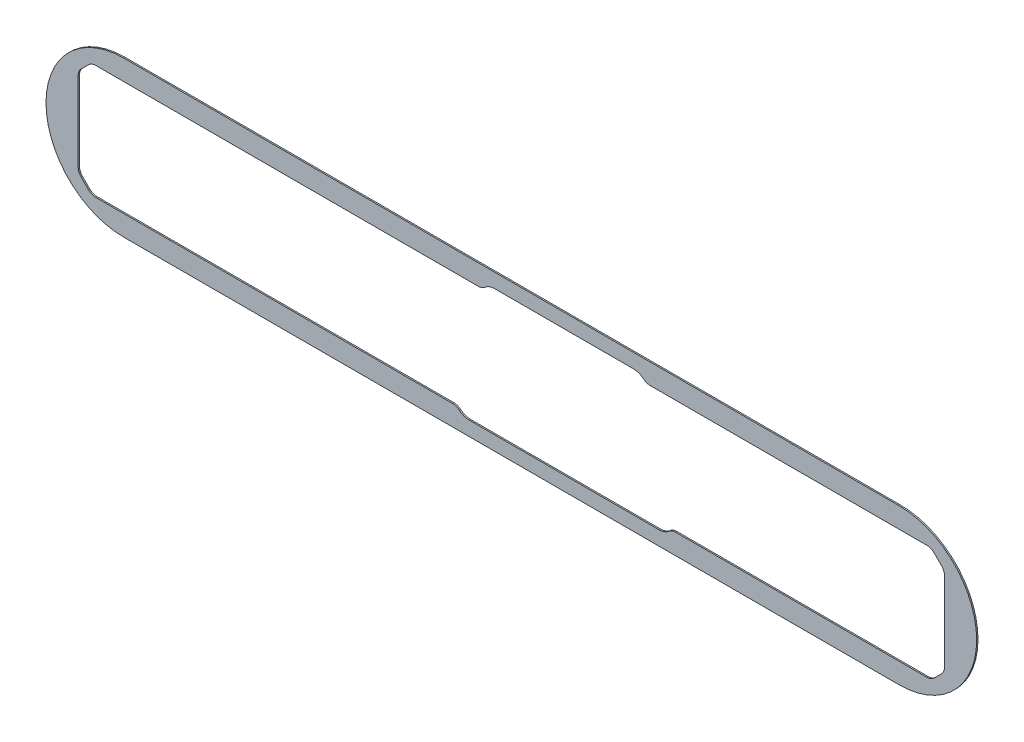
ISO-10303-21;
HEADER;
FILE_DESCRIPTION(('STEP AP214'),'2;1');
FILE_NAME('part.step','',(''),(''),'','','');
FILE_SCHEMA(('AUTOMOTIVE_DESIGN { 1 0 10303 214 1 1 1 1 }'));
ENDSEC;
DATA;
#1=APPLICATION_CONTEXT('core data for automotive mechanical design processes');
#2=APPLICATION_PROTOCOL_DEFINITION('international standard','automotive_design',2000,#1);
#3=PRODUCT_CONTEXT('',#1,'mechanical');
#4=PRODUCT('Part','Part','',(#3));
#5=PRODUCT_RELATED_PRODUCT_CATEGORY('part','',(#4));
#6=PRODUCT_DEFINITION_FORMATION('','',#4);
#7=PRODUCT_DEFINITION_CONTEXT('part definition',#1,'design');
#8=PRODUCT_DEFINITION('design','',#6,#7);
#9=PRODUCT_DEFINITION_SHAPE('','',#8);
#10=(LENGTH_UNIT() NAMED_UNIT(*) SI_UNIT(.MILLI.,.METRE.));
#11=(NAMED_UNIT(*) PLANE_ANGLE_UNIT() SI_UNIT($,.RADIAN.));
#12=(NAMED_UNIT(*) SI_UNIT($,.STERADIAN.) SOLID_ANGLE_UNIT());
#13=UNCERTAINTY_MEASURE_WITH_UNIT(LENGTH_MEASURE(1.E-05),#10,'distance_accuracy_value','');
#14=(GEOMETRIC_REPRESENTATION_CONTEXT(3) GLOBAL_UNCERTAINTY_ASSIGNED_CONTEXT((#13)) GLOBAL_UNIT_ASSIGNED_CONTEXT((#10,
#11,#12)) REPRESENTATION_CONTEXT('',''));
#15=CARTESIAN_POINT('',(0.,0.,0.));
#16=DIRECTION('',(0.,0.,1.));
#17=DIRECTION('',(1.,0.,0.));
#18=AXIS2_PLACEMENT_3D('',#15,#16,#17);
#19=CARTESIAN_POINT('',(16.09980768536,-6.6,-50.771344));
#20=DIRECTION('',(-5.226938539498E-11,0.,1.));
#21=DIRECTION('',(0.,1.,0.));
#22=AXIS2_PLACEMENT_3D('',#19,#20,#21);
#23=CYLINDRICAL_SURFACE('',#22,1.);
#24=DIRECTION('',(-5.233420534541E-11,0.,1.));
#25=VECTOR('',#24,1.);
#26=CARTESIAN_POINT('',(16.09980768275,-5.6,-0.805));
#27=LINE('',#26,#25);
#28=CARTESIAN_POINT('',(16.09980768275,-5.6,-0.805));
#29=VERTEX_POINT('',#28);
#30=CARTESIAN_POINT('',(16.09980768274,-5.6,-0.675));
#31=VERTEX_POINT('',#30);
#32=EDGE_CURVE('E600',#29,#31,#27,.T.);
#33=ORIENTED_EDGE('',*,*,#32,.F.);
#34=CARTESIAN_POINT('',(16.09980768275,-6.6,-0.8049999999822));
#35=DIRECTION('',(5.22693650197882E-11,0.,-1.));
#36=DIRECTION('',(-0.649923072370997,0.759999999999897,-3.39710481966899E-11));
#37=AXIS2_PLACEMENT_3D('',#34,#35,#36);
#38=CIRCLE('',#37,1.);
#39=CARTESIAN_POINT('',(15.44988461038,-5.84,-0.805));
#40=VERTEX_POINT('',#39);
#41=EDGE_CURVE('E353',#40,#29,#38,.T.);
#42=ORIENTED_EDGE('',*,*,#41,.F.);
#43=DIRECTION('',(-5.226588392851E-11,0.,1.));
#44=VECTOR('',#43,1.);
#45=CARTESIAN_POINT('',(15.44988461038,-5.84,-0.805));
#46=LINE('',#45,#44);
#47=CARTESIAN_POINT('',(15.44988461037,-5.84,-0.6750000000161));
#48=VERTEX_POINT('',#47);
#49=EDGE_CURVE('E11',#40,#48,#46,.T.);
#50=ORIENTED_EDGE('',*,*,#49,.T.);
#51=CARTESIAN_POINT('',(16.09980768274,-6.6,-0.6749999999822));
#52=DIRECTION('',(-5.226938539498E-11,0.,1.));
#53=DIRECTION('',(0.,1.,0.));
#54=AXIS2_PLACEMENT_3D('',#51,#52,#53);
#55=CIRCLE('',#54,1.);
#56=EDGE_CURVE('E484',#31,#48,#55,.T.);
#57=ORIENTED_EDGE('',*,*,#56,.F.);
#58=EDGE_LOOP('',(#33,#42,#50,#57));
#59=FACE_BOUND('',#58,.T.);
#60=ADVANCED_FACE('F16',(#59),#23,.T.);
#61=CARTESIAN_POINT('',(14.47500000028,-4.7,28.731344));
#62=DIRECTION('',(5.2269385394983E-11,0.,-1.));
#63=DIRECTION('',(0.7999999998137,-0.6000000002484,4.181550830625E-11));
#64=AXIS2_PLACEMENT_3D('',#61,#62,#63);
#65=CYLINDRICAL_SURFACE('',#64,1.5);
#66=CARTESIAN_POINT('',(14.47500000182,-4.7,-0.8050000000267));
#67=DIRECTION('',(-5.226938539498E-11,0.,1.));
#68=DIRECTION('',(-1.21549466788E-09,-1.,0.));
#69=AXIS2_PLACEMENT_3D('',#66,#67,#68);
#70=CIRCLE('',#69,1.5);
#71=CARTESIAN_POINT('',(14.475,-6.2,-0.805));
#72=VERTEX_POINT('',#71);
#73=EDGE_CURVE('E358',#72,#40,#70,.T.);
#74=ORIENTED_EDGE('',*,*,#73,.F.);
#75=DIRECTION('',(0.,0.,-1.));
#76=VECTOR('',#75,1.);
#77=CARTESIAN_POINT('',(14.475,-6.2,-0.675));
#78=LINE('',#77,#76);
#79=CARTESIAN_POINT('',(14.475,-6.2,-0.675));
#80=VERTEX_POINT('',#79);
#81=EDGE_CURVE('E27',#80,#72,#78,.T.);
#82=ORIENTED_EDGE('',*,*,#81,.F.);
#83=CARTESIAN_POINT('',(14.47500000182,-4.7,-0.6750000000267));
#84=DIRECTION('',(5.2269365019795E-11,0.,-1.));
#85=DIRECTION('',(0.649923072370783,-0.76000000000008,3.39710481966891E-11));
#86=AXIS2_PLACEMENT_3D('',#83,#84,#85);
#87=CIRCLE('',#86,1.5);
#88=EDGE_CURVE('E386',#48,#80,#87,.T.);
#89=ORIENTED_EDGE('',*,*,#88,.F.);
#90=ORIENTED_EDGE('',*,*,#49,.F.);
#91=EDGE_LOOP('',(#74,#82,#89,#90));
#92=FACE_BOUND('',#91,.T.);
#93=ADVANCED_FACE('F577',(#92),#65,.F.);
#94=CARTESIAN_POINT('',(-5.325,-6.2,0.));
#95=DIRECTION('',(0.,-1.,0.));
#96=DIRECTION('',(0.,0.,-1.));
#97=AXIS2_PLACEMENT_3D('',#94,#95,#96);
#98=PLANE('',#97);
#99=ORIENTED_EDGE('',*,*,#81,.T.);
#100=DIRECTION('',(1.,0.,0.));
#101=VECTOR('',#100,1.);
#102=CARTESIAN_POINT('',(-4.125,-6.2,-0.805));
#103=LINE('',#102,#101);
#104=CARTESIAN_POINT('',(-4.125,-6.2,-0.805));
#105=VERTEX_POINT('',#104);
#106=EDGE_CURVE('E595',#105,#72,#103,.T.);
#107=ORIENTED_EDGE('',*,*,#106,.F.);
#108=DIRECTION('',(0.,0.,-1.));
#109=VECTOR('',#108,1.);
#110=CARTESIAN_POINT('',(-4.125,-6.2,-0.675));
#111=LINE('',#110,#109);
#112=CARTESIAN_POINT('',(-4.125,-6.2,-0.675));
#113=VERTEX_POINT('',#112);
#114=EDGE_CURVE('E348',#113,#105,#111,.T.);
#115=ORIENTED_EDGE('',*,*,#114,.F.);
#116=DIRECTION('',(1.,0.,0.));
#117=VECTOR('',#116,1.);
#118=CARTESIAN_POINT('',(-4.125,-6.2,-0.675));
#119=LINE('',#118,#117);
#120=EDGE_CURVE('E381',#113,#80,#119,.T.);
#121=ORIENTED_EDGE('',*,*,#120,.T.);
#122=EDGE_LOOP('',(#99,#107,#115,#121));
#123=FACE_BOUND('',#122,.T.);
#124=ADVANCED_FACE('F745',(#123),#98,.F.);
#125=CARTESIAN_POINT('',(-4.12499999553,-4.7,28.731344));
#126=DIRECTION('',(0.,0.,-1.));
#127=DIRECTION('',(-0.8000000029802,-0.5999999960264,0.));
#128=AXIS2_PLACEMENT_3D('',#125,#126,#127);
#129=CYLINDRICAL_SURFACE('',#128,1.5);
#130=CARTESIAN_POINT('',(-4.12499999553,-4.7,-0.675));
#131=DIRECTION('',(0.,0.,-1.));
#132=DIRECTION('',(-2.980231765074E-09,-1.,0.));
#133=AXIS2_PLACEMENT_3D('',#130,#131,#132);
#134=CIRCLE('',#133,1.5);
#135=CARTESIAN_POINT('',(-5.099884604086,-5.84,-0.675));
#136=VERTEX_POINT('',#135);
#137=EDGE_CURVE('E385',#113,#136,#134,.T.);
#138=ORIENTED_EDGE('',*,*,#137,.F.);
#139=ORIENTED_EDGE('',*,*,#114,.T.);
#140=CARTESIAN_POINT('',(-4.12499999553,-4.7,-0.805));
#141=DIRECTION('',(0.,0.,1.));
#142=DIRECTION('',(-0.64992307237094,-0.759999999999946,0.));
#143=AXIS2_PLACEMENT_3D('',#140,#141,#142);
#144=CIRCLE('',#143,1.5);
#145=CARTESIAN_POINT('',(-5.099884604086,-5.84,-0.805));
#146=VERTEX_POINT('',#145);
#147=EDGE_CURVE('E454',#146,#105,#144,.T.);
#148=ORIENTED_EDGE('',*,*,#147,.F.);
#149=DIRECTION('',(0.,0.,-1.));
#150=VECTOR('',#149,1.);
#151=CARTESIAN_POINT('',(-5.099884604086,-5.84,-0.675));
#152=LINE('',#151,#150);
#153=EDGE_CURVE('E352',#136,#146,#152,.T.);
#154=ORIENTED_EDGE('',*,*,#153,.F.);
#155=EDGE_LOOP('',(#138,#139,#148,#154));
#156=FACE_BOUND('',#155,.T.);
#157=ADVANCED_FACE('F775',(#156),#129,.F.);
#158=CARTESIAN_POINT('',(-5.749807676457,-6.6,28.731344));
#159=DIRECTION('',(0.,0.,-1.));
#160=DIRECTION('',(0.,1.,0.));
#161=AXIS2_PLACEMENT_3D('',#158,#159,#160);
#162=CYLINDRICAL_SURFACE('',#161,1.);
#163=DIRECTION('',(0.,0.,-1.));
#164=VECTOR('',#163,1.);
#165=CARTESIAN_POINT('',(-5.749807676457,-5.6,-0.675));
#166=LINE('',#165,#164);
#167=CARTESIAN_POINT('',(-5.749807676457,-5.6,-0.675));
#168=VERTEX_POINT('',#167);
#169=CARTESIAN_POINT('',(-5.749807676457,-5.6,-0.805));
#170=VERTEX_POINT('',#169);
#171=EDGE_CURVE('E509',#168,#170,#166,.T.);
#172=ORIENTED_EDGE('',*,*,#171,.F.);
#173=CARTESIAN_POINT('',(-5.749807676457,-6.6,-0.675));
#174=DIRECTION('',(0.,0.,1.));
#175=DIRECTION('',(0.649923072370783,0.76000000000008,0.));
#176=AXIS2_PLACEMENT_3D('',#173,#174,#175);
#177=CIRCLE('',#176,1.);
#178=EDGE_CURVE('E446',#136,#168,#177,.T.);
#179=ORIENTED_EDGE('',*,*,#178,.F.);
#180=ORIENTED_EDGE('',*,*,#153,.T.);
#181=CARTESIAN_POINT('',(-5.749807676457,-6.6,-0.805));
#182=DIRECTION('',(0.,0.,-1.));
#183=DIRECTION('',(0.,1.,0.));
#184=AXIS2_PLACEMENT_3D('',#181,#182,#183);
#185=CIRCLE('',#184,1.);
#186=EDGE_CURVE('E373',#170,#146,#185,.T.);
#187=ORIENTED_EDGE('',*,*,#186,.F.);
#188=EDGE_LOOP('',(#172,#179,#180,#187));
#189=FACE_BOUND('',#188,.T.);
#190=ADVANCED_FACE('F724',(#189),#162,.T.);
#191=CARTESIAN_POINT('',(-40.72431457505,4.6,28.731344));
#192=DIRECTION('',(0.,0.,-1.));
#193=DIRECTION('',(-0.707106781186548,0.707106781186548,0.));
#194=AXIS2_PLACEMENT_3D('',#191,#192,#193);
#195=CYLINDRICAL_SURFACE('',#194,1.);
#196=CARTESIAN_POINT('',(-40.72431457505,4.6,-0.805));
#197=DIRECTION('',(0.,0.,1.));
#198=DIRECTION('',(0.,1.,0.));
#199=AXIS2_PLACEMENT_3D('',#196,#197,#198);
#200=CIRCLE('',#199,1.);
#201=CARTESIAN_POINT('',(-40.72431457505,5.6,-0.805));
#202=VERTEX_POINT('',#201);
#203=CARTESIAN_POINT('',(-41.43142135624,5.307106781187,-0.805));
#204=VERTEX_POINT('',#203);
#205=EDGE_CURVE('E347',#202,#204,#200,.T.);
#206=ORIENTED_EDGE('',*,*,#205,.F.);
#207=DIRECTION('',(0.,0.,-1.));
#208=VECTOR('',#207,1.);
#209=CARTESIAN_POINT('',(-40.72431457505,5.6,-0.675));
#210=LINE('',#209,#208);
#211=CARTESIAN_POINT('',(-40.72431457505,5.6,-0.675));
#212=VERTEX_POINT('',#211);
#213=EDGE_CURVE('E423',#212,#202,#210,.T.);
#214=ORIENTED_EDGE('',*,*,#213,.F.);
#215=CARTESIAN_POINT('',(-40.72431457505,4.6,-0.675));
#216=DIRECTION('',(0.,0.,-1.));
#217=DIRECTION('',(-0.707106781186548,0.707106781186548,0.));
#218=AXIS2_PLACEMENT_3D('',#215,#216,#217);
#219=CIRCLE('',#218,1.);
#220=CARTESIAN_POINT('',(-41.43142135624,5.307106781187,-0.675));
#221=VERTEX_POINT('',#220);
#222=EDGE_CURVE('E363',#221,#212,#219,.T.);
#223=ORIENTED_EDGE('',*,*,#222,.F.);
#224=DIRECTION('',(0.,0.,-1.));
#225=VECTOR('',#224,1.);
#226=CARTESIAN_POINT('',(-41.43142135624,5.307106781187,-0.675));
#227=LINE('',#226,#225);
#228=EDGE_CURVE('E480',#221,#204,#227,.T.);
#229=ORIENTED_EDGE('',*,*,#228,.T.);
#230=EDGE_LOOP('',(#206,#214,#223,#229));
#231=FACE_BOUND('',#230,.T.);
#232=ADVANCED_FACE('F669',(#231),#195,.F.);
#233=CARTESIAN_POINT('',(-41.13852813742,5.6,0.));
#234=DIRECTION('',(-0.707106781186548,0.707106781186548,0.));
#235=DIRECTION('',(0.,0.,1.));
#236=AXIS2_PLACEMENT_3D('',#233,#234,#235);
#237=PLANE('',#236);
#238=DIRECTION('',(-0.707106781186498,-0.707106781186598,0.));
#239=VECTOR('',#238,1.);
#240=CARTESIAN_POINT('',(-41.43142135624,5.307106781187,-0.675));
#241=LINE('',#240,#239);
#242=CARTESIAN_POINT('',(-42.15710678119,4.581421356237,-0.675));
#243=VERTEX_POINT('',#242);
#244=EDGE_CURVE('E359',#221,#243,#241,.T.);
#245=ORIENTED_EDGE('',*,*,#244,.T.);
#246=DIRECTION('',(0.,0.,-1.));
#247=VECTOR('',#246,1.);
#248=CARTESIAN_POINT('',(-42.15710678119,4.581421356237,-0.675));
#249=LINE('',#248,#247);
#250=CARTESIAN_POINT('',(-42.15710678119,4.581421356237,-0.805));
#251=VERTEX_POINT('',#250);
#252=EDGE_CURVE('E486',#243,#251,#249,.T.);
#253=ORIENTED_EDGE('',*,*,#252,.T.);
#254=DIRECTION('',(-0.707106781186498,-0.707106781186598,0.));
#255=VECTOR('',#254,1.);
#256=CARTESIAN_POINT('',(-41.43142135624,5.307106781187,-0.805));
#257=LINE('',#256,#255);
#258=EDGE_CURVE('E342',#204,#251,#257,.T.);
#259=ORIENTED_EDGE('',*,*,#258,.F.);
#260=ORIENTED_EDGE('',*,*,#228,.F.);
#261=EDGE_LOOP('',(#245,#253,#259,#260));
#262=FACE_BOUND('',#261,.T.);
#263=ADVANCED_FACE('F666',(#262),#237,.F.);
#264=CARTESIAN_POINT('',(-41.45,3.874314575051,28.731344));
#265=DIRECTION('',(0.,0.,-1.));
#266=DIRECTION('',(-1.,0.,0.));
#267=AXIS2_PLACEMENT_3D('',#264,#265,#266);
#268=CYLINDRICAL_SURFACE('',#267,1.);
#269=CARTESIAN_POINT('',(-41.45,3.874314575051,-0.805));
#270=DIRECTION('',(0.,0.,1.));
#271=DIRECTION('',(-0.707106781186548,0.707106781186548,0.));
#272=AXIS2_PLACEMENT_3D('',#269,#270,#271);
#273=CIRCLE('',#272,1.);
#274=CARTESIAN_POINT('',(-42.45,3.874314575051,-0.805));
#275=VERTEX_POINT('',#274);
#276=EDGE_CURVE('E346',#251,#275,#273,.T.);
#277=ORIENTED_EDGE('',*,*,#276,.F.);
#278=ORIENTED_EDGE('',*,*,#252,.F.);
#279=CARTESIAN_POINT('',(-41.45,3.874314575051,-0.675));
#280=DIRECTION('',(0.,0.,-1.));
#281=DIRECTION('',(-1.,0.,0.));
#282=AXIS2_PLACEMENT_3D('',#279,#280,#281);
#283=CIRCLE('',#282,1.);
#284=CARTESIAN_POINT('',(-42.45,3.874314575051,-0.675));
#285=VERTEX_POINT('',#284);
#286=EDGE_CURVE('E364',#285,#243,#283,.T.);
#287=ORIENTED_EDGE('',*,*,#286,.F.);
#288=DIRECTION('',(0.,0.,-1.));
#289=VECTOR('',#288,1.);
#290=CARTESIAN_POINT('',(-42.45,3.874314575051,-0.675));
#291=LINE('',#290,#289);
#292=EDGE_CURVE('E335',#285,#275,#291,.T.);
#293=ORIENTED_EDGE('',*,*,#292,.T.);
#294=EDGE_LOOP('',(#277,#278,#287,#293));
#295=FACE_BOUND('',#294,.T.);
#296=ADVANCED_FACE('F661',(#295),#268,.F.);
#297=CARTESIAN_POINT('',(-42.45,4.288528137424,0.));
#298=DIRECTION('',(-1.,0.,0.));
#299=DIRECTION('',(0.,0.,1.));
#300=AXIS2_PLACEMENT_3D('',#297,#298,#299);
#301=PLANE('',#300);
#302=DIRECTION('',(0.,-1.,0.));
#303=VECTOR('',#302,1.);
#304=CARTESIAN_POINT('',(-42.45,3.874314575051,-0.675));
#305=LINE('',#304,#303);
#306=CARTESIAN_POINT('',(-42.45,-3.874314575051,-0.675));
#307=VERTEX_POINT('',#306);
#308=EDGE_CURVE('E450',#285,#307,#305,.T.);
#309=ORIENTED_EDGE('',*,*,#308,.T.);
#310=DIRECTION('',(0.,0.,-1.));
#311=VECTOR('',#310,1.);
#312=CARTESIAN_POINT('',(-42.45,-3.874314575051,-0.675));
#313=LINE('',#312,#311);
#314=CARTESIAN_POINT('',(-42.45,-3.874314575051,-0.805));
#315=VERTEX_POINT('',#314);
#316=EDGE_CURVE('E332',#307,#315,#313,.T.);
#317=ORIENTED_EDGE('',*,*,#316,.T.);
#318=DIRECTION('',(0.,-1.,0.));
#319=VECTOR('',#318,1.);
#320=CARTESIAN_POINT('',(-42.45,3.874314575051,-0.805));
#321=LINE('',#320,#319);
#322=EDGE_CURVE('E368',#275,#315,#321,.T.);
#323=ORIENTED_EDGE('',*,*,#322,.F.);
#324=ORIENTED_EDGE('',*,*,#292,.F.);
#325=EDGE_LOOP('',(#309,#317,#323,#324));
#326=FACE_BOUND('',#325,.T.);
#327=ADVANCED_FACE('F648',(#326),#301,.F.);
#328=CARTESIAN_POINT('',(-41.45,-3.874314575051,28.731344));
#329=DIRECTION('',(0.,0.,-1.));
#330=DIRECTION('',(-0.707106781186548,-0.707106781186548,0.));
#331=AXIS2_PLACEMENT_3D('',#328,#329,#330);
#332=CYLINDRICAL_SURFACE('',#331,1.);
#333=CARTESIAN_POINT('',(-41.45,-3.874314575051,-0.805));
#334=DIRECTION('',(0.,0.,1.));
#335=DIRECTION('',(-1.,0.,0.));
#336=AXIS2_PLACEMENT_3D('',#333,#334,#335);
#337=CIRCLE('',#336,1.);
#338=CARTESIAN_POINT('',(-42.15710678119,-4.581421356237,-0.805));
#339=VERTEX_POINT('',#338);
#340=EDGE_CURVE('E419',#315,#339,#337,.T.);
#341=ORIENTED_EDGE('',*,*,#340,.F.);
#342=ORIENTED_EDGE('',*,*,#316,.F.);
#343=CARTESIAN_POINT('',(-41.45,-3.874314575051,-0.675));
#344=DIRECTION('',(0.,0.,-1.));
#345=DIRECTION('',(-0.707106781186548,-0.707106781186548,0.));
#346=AXIS2_PLACEMENT_3D('',#343,#344,#345);
#347=CIRCLE('',#346,1.);
#348=CARTESIAN_POINT('',(-42.15710678119,-4.581421356237,-0.675));
#349=VERTEX_POINT('',#348);
#350=EDGE_CURVE('E327',#349,#307,#347,.T.);
#351=ORIENTED_EDGE('',*,*,#350,.F.);
#352=DIRECTION('',(0.,0.,-1.));
#353=VECTOR('',#352,1.);
#354=CARTESIAN_POINT('',(-42.15710678119,-4.581421356237,-0.675));
#355=LINE('',#354,#353);
#356=EDGE_CURVE('E336',#349,#339,#355,.T.);
#357=ORIENTED_EDGE('',*,*,#356,.T.);
#358=EDGE_LOOP('',(#341,#342,#351,#357));
#359=FACE_BOUND('',#358,.T.);
#360=ADVANCED_FACE('F656',(#359),#332,.F.);
#361=CARTESIAN_POINT('',(-42.45,-4.288528137424,0.));
#362=DIRECTION('',(-0.707106781186548,-0.707106781186548,0.));
#363=DIRECTION('',(-0.707106781186548,0.707106781186548,0.));
#364=AXIS2_PLACEMENT_3D('',#361,#362,#363);
#365=PLANE('',#364);
#366=DIRECTION('',(0.707106781186498,-0.707106781186598,0.));
#367=VECTOR('',#366,1.);
#368=CARTESIAN_POINT('',(-42.15710678119,-4.581421356237,-0.675));
#369=LINE('',#368,#367);
#370=CARTESIAN_POINT('',(-41.43142135624,-5.307106781187,-0.675));
#371=VERTEX_POINT('',#370);
#372=EDGE_CURVE('E323',#349,#371,#369,.T.);
#373=ORIENTED_EDGE('',*,*,#372,.T.);
#374=DIRECTION('',(0.,0.,-1.));
#375=VECTOR('',#374,1.);
#376=CARTESIAN_POINT('',(-41.43142135624,-5.307106781187,-0.675));
#377=LINE('',#376,#375);
#378=CARTESIAN_POINT('',(-41.43142135624,-5.307106781187,-0.805));
#379=VERTEX_POINT('',#378);
#380=EDGE_CURVE('E617',#371,#379,#377,.T.);
#381=ORIENTED_EDGE('',*,*,#380,.T.);
#382=DIRECTION('',(0.707106781186498,-0.707106781186598,0.));
#383=VECTOR('',#382,1.);
#384=CARTESIAN_POINT('',(-42.15710678119,-4.581421356237,-0.805));
#385=LINE('',#384,#383);
#386=EDGE_CURVE('E397',#339,#379,#385,.T.);
#387=ORIENTED_EDGE('',*,*,#386,.F.);
#388=ORIENTED_EDGE('',*,*,#356,.F.);
#389=EDGE_LOOP('',(#373,#381,#387,#388));
#390=FACE_BOUND('',#389,.T.);
#391=ADVANCED_FACE('F727',(#390),#365,.F.);
#392=CARTESIAN_POINT('',(-40.72431457505,-4.6,28.731344));
#393=DIRECTION('',(0.,0.,-1.));
#394=DIRECTION('',(0.,-1.,0.));
#395=AXIS2_PLACEMENT_3D('',#392,#393,#394);
#396=CYLINDRICAL_SURFACE('',#395,1.);
#397=CARTESIAN_POINT('',(-40.72431457505,-4.6,-0.805));
#398=DIRECTION('',(0.,0.,1.));
#399=DIRECTION('',(-0.707106781186548,-0.707106781186548,0.));
#400=AXIS2_PLACEMENT_3D('',#397,#398,#399);
#401=CIRCLE('',#400,1.);
#402=CARTESIAN_POINT('',(-40.72431457505,-5.6,-0.805));
#403=VERTEX_POINT('',#402);
#404=EDGE_CURVE('E374',#379,#403,#401,.T.);
#405=ORIENTED_EDGE('',*,*,#404,.F.);
#406=ORIENTED_EDGE('',*,*,#380,.F.);
#407=CARTESIAN_POINT('',(-40.72431457505,-4.6,-0.675));
#408=DIRECTION('',(0.,0.,-1.));
#409=DIRECTION('',(0.,-1.,0.));
#410=AXIS2_PLACEMENT_3D('',#407,#408,#409);
#411=CIRCLE('',#410,1.);
#412=CARTESIAN_POINT('',(-40.72431457505,-5.6,-0.675));
#413=VERTEX_POINT('',#412);
#414=EDGE_CURVE('E328',#413,#371,#411,.T.);
#415=ORIENTED_EDGE('',*,*,#414,.F.);
#416=DIRECTION('',(0.,0.,-1.));
#417=VECTOR('',#416,1.);
#418=CARTESIAN_POINT('',(-40.72431457505,-5.6,-0.675));
#419=LINE('',#418,#417);
#420=EDGE_CURVE('E511',#413,#403,#419,.T.);
#421=ORIENTED_EDGE('',*,*,#420,.T.);
#422=EDGE_LOOP('',(#405,#406,#415,#421));
#423=FACE_BOUND('',#422,.T.);
#424=ADVANCED_FACE('F720',(#423),#396,.F.);
#425=CARTESIAN_POINT('',(-41.13852813742,-5.6,0.));
#426=DIRECTION('',(0.,-1.,0.));
#427=DIRECTION('',(0.,0.,-1.));
#428=AXIS2_PLACEMENT_3D('',#425,#426,#427);
#429=PLANE('',#428);
#430=DIRECTION('',(0.,0.,-1.));
#431=VECTOR('',#430,1.);
#432=CARTESIAN_POINT('',(40.72431457505,-5.6,-0.675));
#433=LINE('',#432,#431);
#434=CARTESIAN_POINT('',(40.72431457505,-5.6,-0.675));
#435=VERTEX_POINT('',#434);
#436=CARTESIAN_POINT('',(40.72431457505,-5.6,-0.805));
#437=VERTEX_POINT('',#436);
#438=EDGE_CURVE('E437',#435,#437,#433,.T.);
#439=ORIENTED_EDGE('',*,*,#438,.T.);
#440=DIRECTION('',(1.,0.,0.));
#441=VECTOR('',#440,1.);
#442=CARTESIAN_POINT('',(16.09980768275,-5.6,-0.805));
#443=LINE('',#442,#441);
#444=EDGE_CURVE('E357',#29,#437,#443,.T.);
#445=ORIENTED_EDGE('',*,*,#444,.F.);
#446=ORIENTED_EDGE('',*,*,#32,.T.);
#447=DIRECTION('',(1.,0.,0.));
#448=VECTOR('',#447,1.);
#449=CARTESIAN_POINT('',(16.09980768274,-5.6,-0.675));
#450=LINE('',#449,#448);
#451=EDGE_CURVE('E459',#31,#435,#450,.T.);
#452=ORIENTED_EDGE('',*,*,#451,.T.);
#453=EDGE_LOOP('',(#439,#445,#446,#452));
#454=FACE_BOUND('',#453,.T.);
#455=ADVANCED_FACE('F735',(#454),#429,.F.);
#456=CARTESIAN_POINT('',(-41.13852813742,-5.6,0.));
#457=DIRECTION('',(0.,-1.,0.));
#458=DIRECTION('',(0.,0.,-1.));
#459=AXIS2_PLACEMENT_3D('',#456,#457,#458);
#460=PLANE('',#459);
#461=ORIENTED_EDGE('',*,*,#171,.T.);
#462=DIRECTION('',(1.,0.,0.));
#463=VECTOR('',#462,1.);
#464=CARTESIAN_POINT('',(-40.72431457505,-5.6,-0.805));
#465=LINE('',#464,#463);
#466=EDGE_CURVE('E369',#403,#170,#465,.T.);
#467=ORIENTED_EDGE('',*,*,#466,.F.);
#468=ORIENTED_EDGE('',*,*,#420,.F.);
#469=DIRECTION('',(1.,0.,0.));
#470=VECTOR('',#469,1.);
#471=CARTESIAN_POINT('',(-40.72431457505,-5.6,-0.675));
#472=LINE('',#471,#470);
#473=EDGE_CURVE('E442',#413,#168,#472,.T.);
#474=ORIENTED_EDGE('',*,*,#473,.T.);
#475=EDGE_LOOP('',(#461,#467,#468,#474));
#476=FACE_BOUND('',#475,.T.);
#477=ADVANCED_FACE('F716',(#476),#460,.F.);
#478=CARTESIAN_POINT('',(40.72431457505,-4.6,28.731344));
#479=DIRECTION('',(0.,0.,-1.));
#480=DIRECTION('',(0.707106781186548,-0.707106781186548,0.));
#481=AXIS2_PLACEMENT_3D('',#478,#479,#480);
#482=CYLINDRICAL_SURFACE('',#481,1.);
#483=CARTESIAN_POINT('',(40.72431457505,-4.6,-0.805));
#484=DIRECTION('',(0.,0.,1.));
#485=DIRECTION('',(0.,-1.,0.));
#486=AXIS2_PLACEMENT_3D('',#483,#484,#485);
#487=CIRCLE('',#486,1.);
#488=CARTESIAN_POINT('',(41.43142135624,-5.307106781187,-0.805));
#489=VERTEX_POINT('',#488);
#490=EDGE_CURVE('E522',#437,#489,#487,.T.);
#491=ORIENTED_EDGE('',*,*,#490,.F.);
#492=ORIENTED_EDGE('',*,*,#438,.F.);
#493=CARTESIAN_POINT('',(40.72431457505,-4.6,-0.675));
#494=DIRECTION('',(0.,0.,-1.));
#495=DIRECTION('',(0.707106781186548,-0.707106781186548,0.));
#496=AXIS2_PLACEMENT_3D('',#493,#494,#495);
#497=CIRCLE('',#496,1.);
#498=CARTESIAN_POINT('',(41.43142135624,-5.307106781187,-0.675));
#499=VERTEX_POINT('',#498);
#500=EDGE_CURVE('E455',#499,#435,#497,.T.);
#501=ORIENTED_EDGE('',*,*,#500,.F.);
#502=DIRECTION('',(0.,0.,-1.));
#503=VECTOR('',#502,1.);
#504=CARTESIAN_POINT('',(41.43142135624,-5.307106781187,-0.675));
#505=LINE('',#504,#503);
#506=EDGE_CURVE('E434',#499,#489,#505,.T.);
#507=ORIENTED_EDGE('',*,*,#506,.T.);
#508=EDGE_LOOP('',(#491,#492,#501,#507));
#509=FACE_BOUND('',#508,.T.);
#510=ADVANCED_FACE('F754',(#509),#482,.F.);
#511=CARTESIAN_POINT('',(41.13852813742,-5.6,0.));
#512=DIRECTION('',(0.707106781186548,-0.707106781186548,0.));
#513=DIRECTION('',(0.,0.,-1.));
#514=AXIS2_PLACEMENT_3D('',#511,#512,#513);
#515=PLANE('',#514);
#516=DIRECTION('',(0.707106781186498,0.707106781186598,0.));
#517=VECTOR('',#516,1.);
#518=CARTESIAN_POINT('',(41.43142135624,-5.307106781187,-0.675));
#519=LINE('',#518,#517);
#520=CARTESIAN_POINT('',(42.15710678119,-4.581421356237,-0.675));
#521=VERTEX_POINT('',#520);
#522=EDGE_CURVE('E460',#499,#521,#519,.T.);
#523=ORIENTED_EDGE('',*,*,#522,.T.);
#524=DIRECTION('',(0.,0.,-1.));
#525=VECTOR('',#524,1.);
#526=CARTESIAN_POINT('',(42.15710678119,-4.581421356237,-0.675));
#527=LINE('',#526,#525);
#528=CARTESIAN_POINT('',(42.15710678119,-4.581421356237,-0.805));
#529=VERTEX_POINT('',#528);
#530=EDGE_CURVE('E438',#521,#529,#527,.T.);
#531=ORIENTED_EDGE('',*,*,#530,.T.);
#532=DIRECTION('',(0.707106781186498,0.707106781186598,0.));
#533=VECTOR('',#532,1.);
#534=CARTESIAN_POINT('',(41.43142135624,-5.307106781187,-0.805));
#535=LINE('',#534,#533);
#536=EDGE_CURVE('E529',#489,#529,#535,.T.);
#537=ORIENTED_EDGE('',*,*,#536,.F.);
#538=ORIENTED_EDGE('',*,*,#506,.F.);
#539=EDGE_LOOP('',(#523,#531,#537,#538));
#540=FACE_BOUND('',#539,.T.);
#541=ADVANCED_FACE('F761',(#540),#515,.F.);
#542=CARTESIAN_POINT('',(41.45,-3.874314575051,28.731344));
#543=DIRECTION('',(0.,0.,-1.));
#544=DIRECTION('',(1.,0.,0.));
#545=AXIS2_PLACEMENT_3D('',#542,#543,#544);
#546=CYLINDRICAL_SURFACE('',#545,1.);
#547=CARTESIAN_POINT('',(41.45,-3.874314575051,-0.805));
#548=DIRECTION('',(0.,0.,1.));
#549=DIRECTION('',(0.707106781186548,-0.707106781186548,0.));
#550=AXIS2_PLACEMENT_3D('',#547,#548,#549);
#551=CIRCLE('',#550,1.);
#552=CARTESIAN_POINT('',(42.45,-3.874314575051,-0.805));
#553=VERTEX_POINT('',#552);
#554=EDGE_CURVE('E312',#529,#553,#551,.T.);
#555=ORIENTED_EDGE('',*,*,#554,.F.);
#556=ORIENTED_EDGE('',*,*,#530,.F.);
#557=CARTESIAN_POINT('',(41.45,-3.874314575051,-0.675));
#558=DIRECTION('',(0.,0.,-1.));
#559=DIRECTION('',(1.,0.,0.));
#560=AXIS2_PLACEMENT_3D('',#557,#558,#559);
#561=CIRCLE('',#560,1.);
#562=CARTESIAN_POINT('',(42.45,-3.874314575051,-0.675));
#563=VERTEX_POINT('',#562);
#564=EDGE_CURVE('E414',#563,#521,#561,.T.);
#565=ORIENTED_EDGE('',*,*,#564,.F.);
#566=DIRECTION('',(0.,0.,-1.));
#567=VECTOR('',#566,1.);
#568=CARTESIAN_POINT('',(42.45,-3.874314575051,-0.675));
#569=LINE('',#568,#567);
#570=EDGE_CURVE('E488',#563,#553,#569,.T.);
#571=ORIENTED_EDGE('',*,*,#570,.T.);
#572=EDGE_LOOP('',(#555,#556,#565,#571));
#573=FACE_BOUND('',#572,.T.);
#574=ADVANCED_FACE('F553',(#573),#546,.F.);
#575=CARTESIAN_POINT('',(42.45,-4.288528137424,0.));
#576=DIRECTION('',(1.,0.,0.));
#577=DIRECTION('',(0.,1.,0.));
#578=AXIS2_PLACEMENT_3D('',#575,#576,#577);
#579=PLANE('',#578);
#580=DIRECTION('',(0.,1.,0.));
#581=VECTOR('',#580,1.);
#582=CARTESIAN_POINT('',(42.45,-3.874314575051,-0.675));
#583=LINE('',#582,#581);
#584=CARTESIAN_POINT('',(42.45,3.874314575051,-0.675));
#585=VERTEX_POINT('',#584);
#586=EDGE_CURVE('E410',#563,#585,#583,.T.);
#587=ORIENTED_EDGE('',*,*,#586,.T.);
#588=DIRECTION('',(0.,0.,-1.));
#589=VECTOR('',#588,1.);
#590=CARTESIAN_POINT('',(42.45,3.874314575051,-0.675));
#591=LINE('',#590,#589);
#592=CARTESIAN_POINT('',(42.45,3.874314575051,-0.805));
#593=VERTEX_POINT('',#592);
#594=EDGE_CURVE('E379',#585,#593,#591,.T.);
#595=ORIENTED_EDGE('',*,*,#594,.T.);
#596=DIRECTION('',(0.,1.,0.));
#597=VECTOR('',#596,1.);
#598=CARTESIAN_POINT('',(42.45,-3.874314575051,-0.805));
#599=LINE('',#598,#597);
#600=EDGE_CURVE('E308',#553,#593,#599,.T.);
#601=ORIENTED_EDGE('',*,*,#600,.F.);
#602=ORIENTED_EDGE('',*,*,#570,.F.);
#603=EDGE_LOOP('',(#587,#595,#601,#602));
#604=FACE_BOUND('',#603,.T.);
#605=ADVANCED_FACE('F768',(#604),#579,.F.);
#606=CARTESIAN_POINT('',(41.45,3.874314575051,28.731344));
#607=DIRECTION('',(0.,0.,-1.));
#608=DIRECTION('',(0.707106781186548,0.707106781186548,0.));
#609=AXIS2_PLACEMENT_3D('',#606,#607,#608);
#610=CYLINDRICAL_SURFACE('',#609,1.);
#611=CARTESIAN_POINT('',(41.45,3.874314575051,-0.805));
#612=DIRECTION('',(0.,0.,1.));
#613=DIRECTION('',(1.,0.,0.));
#614=AXIS2_PLACEMENT_3D('',#611,#612,#613);
#615=CIRCLE('',#614,1.);
#616=CARTESIAN_POINT('',(42.15710678119,4.581421356237,-0.805));
#617=VERTEX_POINT('',#616);
#618=EDGE_CURVE('E311',#593,#617,#615,.T.);
#619=ORIENTED_EDGE('',*,*,#618,.F.);
#620=ORIENTED_EDGE('',*,*,#594,.F.);
#621=CARTESIAN_POINT('',(41.45,3.874314575051,-0.675));
#622=DIRECTION('',(0.,0.,-1.));
#623=DIRECTION('',(0.707106781186548,0.707106781186548,0.));
#624=AXIS2_PLACEMENT_3D('',#621,#622,#623);
#625=CIRCLE('',#624,1.);
#626=CARTESIAN_POINT('',(42.15710678119,4.581421356237,-0.675));
#627=VERTEX_POINT('',#626);
#628=EDGE_CURVE('E408',#627,#585,#625,.T.);
#629=ORIENTED_EDGE('',*,*,#628,.F.);
#630=DIRECTION('',(0.,0.,-1.));
#631=VECTOR('',#630,1.);
#632=CARTESIAN_POINT('',(42.15710678119,4.581421356237,-0.675));
#633=LINE('',#632,#631);
#634=EDGE_CURVE('E375',#627,#617,#633,.T.);
#635=ORIENTED_EDGE('',*,*,#634,.T.);
#636=EDGE_LOOP('',(#619,#620,#629,#635));
#637=FACE_BOUND('',#636,.T.);
#638=ADVANCED_FACE('F788',(#637),#610,.F.);
#639=CARTESIAN_POINT('',(42.45,4.288528137424,0.));
#640=DIRECTION('',(0.707106781186548,0.707106781186548,0.));
#641=DIRECTION('',(0.,0.,-1.));
#642=AXIS2_PLACEMENT_3D('',#639,#640,#641);
#643=PLANE('',#642);
#644=DIRECTION('',(-0.707106781186498,0.707106781186598,0.));
#645=VECTOR('',#644,1.);
#646=CARTESIAN_POINT('',(42.15710678119,4.581421356237,-0.675));
#647=LINE('',#646,#645);
#648=CARTESIAN_POINT('',(41.43142135624,5.307106781187,-0.675));
#649=VERTEX_POINT('',#648);
#650=EDGE_CURVE('E404',#627,#649,#647,.T.);
#651=ORIENTED_EDGE('',*,*,#650,.T.);
#652=DIRECTION('',(0.,0.,-1.));
#653=VECTOR('',#652,1.);
#654=CARTESIAN_POINT('',(41.43142135624,5.307106781187,-0.675));
#655=LINE('',#654,#653);
#656=CARTESIAN_POINT('',(41.43142135624,5.307106781187,-0.805));
#657=VERTEX_POINT('',#656);
#658=EDGE_CURVE('E380',#649,#657,#655,.T.);
#659=ORIENTED_EDGE('',*,*,#658,.T.);
#660=DIRECTION('',(-0.707106781186498,0.707106781186598,0.));
#661=VECTOR('',#660,1.);
#662=CARTESIAN_POINT('',(42.15710678119,4.581421356237,-0.805));
#663=LINE('',#662,#661);
#664=EDGE_CURVE('E318',#617,#657,#663,.T.);
#665=ORIENTED_EDGE('',*,*,#664,.F.);
#666=ORIENTED_EDGE('',*,*,#634,.F.);
#667=EDGE_LOOP('',(#651,#659,#665,#666));
#668=FACE_BOUND('',#667,.T.);
#669=ADVANCED_FACE('F791',(#668),#643,.F.);
#670=CARTESIAN_POINT('',(40.72431457505,4.6,28.731344));
#671=DIRECTION('',(0.,0.,-1.));
#672=DIRECTION('',(0.,1.,0.));
#673=AXIS2_PLACEMENT_3D('',#670,#671,#672);
#674=CYLINDRICAL_SURFACE('',#673,1.);
#675=CARTESIAN_POINT('',(40.72431457505,4.6,-0.805));
#676=DIRECTION('',(0.,0.,1.));
#677=DIRECTION('',(0.707106781186548,0.707106781186548,0.));
#678=AXIS2_PLACEMENT_3D('',#675,#676,#677);
#679=CIRCLE('',#678,1.);
#680=CARTESIAN_POINT('',(40.72431457505,5.6,-0.805));
#681=VERTEX_POINT('',#680);
#682=EDGE_CURVE('E313',#657,#681,#679,.T.);
#683=ORIENTED_EDGE('',*,*,#682,.F.);
#684=ORIENTED_EDGE('',*,*,#658,.F.);
#685=CARTESIAN_POINT('',(40.72431457505,4.6,-0.675));
#686=DIRECTION('',(0.,0.,-1.));
#687=DIRECTION('',(0.,1.,0.));
#688=AXIS2_PLACEMENT_3D('',#685,#686,#687);
#689=CIRCLE('',#688,1.);
#690=CARTESIAN_POINT('',(40.72431457505,5.6,-0.675));
#691=VERTEX_POINT('',#690);
#692=EDGE_CURVE('E409',#691,#649,#689,.T.);
#693=ORIENTED_EDGE('',*,*,#692,.F.);
#694=DIRECTION('',(0.,0.,-1.));
#695=VECTOR('',#694,1.);
#696=CARTESIAN_POINT('',(40.72431457505,5.6,-0.675));
#697=LINE('',#696,#695);
#698=EDGE_CURVE('E426',#691,#681,#697,.T.);
#699=ORIENTED_EDGE('',*,*,#698,.T.);
#700=EDGE_LOOP('',(#683,#684,#693,#699));
#701=FACE_BOUND('',#700,.T.);
#702=ADVANCED_FACE('F793',(#701),#674,.F.);
#703=CARTESIAN_POINT('',(41.13852813742,5.6,0.));
#704=DIRECTION('',(0.,1.,0.));
#705=DIRECTION('',(1.,0.,0.));
#706=AXIS2_PLACEMENT_3D('',#703,#704,#705);
#707=PLANE('',#706);
#708=DIRECTION('',(-1.,0.,0.));
#709=VECTOR('',#708,1.);
#710=CARTESIAN_POINT('',(-3.249807678645,5.6,-0.675));
#711=LINE('',#710,#709);
#712=CARTESIAN_POINT('',(-3.249807678645,5.6,-0.6750000000297));
#713=VERTEX_POINT('',#712);
#714=EDGE_CURVE('E538',#713,#212,#711,.T.);
#715=ORIENTED_EDGE('',*,*,#714,.T.);
#716=ORIENTED_EDGE('',*,*,#213,.T.);
#717=DIRECTION('',(-1.,0.,0.));
#718=VECTOR('',#717,1.);
#719=CARTESIAN_POINT('',(-3.249807678634,5.6,-0.805));
#720=LINE('',#719,#718);
#721=CARTESIAN_POINT('',(-3.249807678634,5.6,-0.8050000000297));
#722=VERTEX_POINT('',#721);
#723=EDGE_CURVE('E402',#722,#202,#720,.T.);
#724=ORIENTED_EDGE('',*,*,#723,.F.);
#725=DIRECTION('',(-8.712347083089E-11,0.,1.));
#726=VECTOR('',#725,1.);
#727=CARTESIAN_POINT('',(-3.249807678634,5.6,-0.805));
#728=LINE('',#727,#726);
#729=EDGE_CURVE('E512',#722,#713,#728,.T.);
#730=ORIENTED_EDGE('',*,*,#729,.T.);
#731=EDGE_LOOP('',(#715,#716,#724,#730));
#732=FACE_BOUND('',#731,.T.);
#733=ADVANCED_FACE('F673',(#732),#707,.F.);
#734=CARTESIAN_POINT('',(41.13852813742,5.6,0.));
#735=DIRECTION('',(0.,1.,0.));
#736=DIRECTION('',(1.,0.,0.));
#737=AXIS2_PLACEMENT_3D('',#734,#735,#736);
#738=PLANE('',#737);
#739=DIRECTION('',(-1.,0.,0.));
#740=VECTOR('',#739,1.);
#741=CARTESIAN_POINT('',(40.72431457505,5.6,-0.805));
#742=LINE('',#741,#740);
#743=CARTESIAN_POINT('',(13.59980766587,5.6,-0.8050000003803));
#744=VERTEX_POINT('',#743);
#745=EDGE_CURVE('E317',#681,#744,#742,.T.);
#746=ORIENTED_EDGE('',*,*,#745,.F.);
#747=ORIENTED_EDGE('',*,*,#698,.F.);
#748=DIRECTION('',(-1.,0.,0.));
#749=VECTOR('',#748,1.);
#750=CARTESIAN_POINT('',(40.72431457505,5.6,-0.675));
#751=LINE('',#750,#749);
#752=CARTESIAN_POINT('',(13.59980766602,5.6,-0.6750000003803));
#753=VERTEX_POINT('',#752);
#754=EDGE_CURVE('E290',#691,#753,#751,.T.);
#755=ORIENTED_EDGE('',*,*,#754,.T.);
#756=DIRECTION('',(-1.115046516658E-09,0.,-1.));
#757=VECTOR('',#756,1.);
#758=CARTESIAN_POINT('',(13.59980766602,5.6,-0.675));
#759=LINE('',#758,#757);
#760=EDGE_CURVE('E41',#753,#744,#759,.T.);
#761=ORIENTED_EDGE('',*,*,#760,.T.);
#762=EDGE_LOOP('',(#746,#747,#755,#761));
#763=FACE_BOUND('',#762,.T.);
#764=ADVANCED_FACE('F797',(#763),#738,.F.);
#765=CARTESIAN_POINT('',(-3.249807674281,6.6,-50.771344));
#766=DIRECTION('',(-8.711564232497E-11,0.,1.));
#767=DIRECTION('',(0.,-1.,0.));
#768=AXIS2_PLACEMENT_3D('',#765,#766,#767);
#769=CYLINDRICAL_SURFACE('',#768,1.);
#770=ORIENTED_EDGE('',*,*,#729,.F.);
#771=CARTESIAN_POINT('',(-3.249807678634,6.6,-0.8050000000297));
#772=DIRECTION('',(8.71156564702986E-11,0.,-1.));
#773=DIRECTION('',(0.649923072370833,-0.760000000000038,5.66184876760228E-11));
#774=AXIS2_PLACEMENT_3D('',#771,#772,#773);
#775=CIRCLE('',#774,1.);
#776=CARTESIAN_POINT('',(-2.599884606263,5.84,-0.805));
#777=VERTEX_POINT('',#776);
#778=EDGE_CURVE('E398',#777,#722,#775,.T.);
#779=ORIENTED_EDGE('',*,*,#778,.F.);
#780=DIRECTION('',(-8.693900300526E-11,1.366428338E-13,1.));
#781=VECTOR('',#780,1.);
#782=CARTESIAN_POINT('',(-2.599884606263,5.84,-0.805));
#783=LINE('',#782,#781);
#784=CARTESIAN_POINT('',(-2.599884606274,5.84,-0.6749999999731));
#785=VERTEX_POINT('',#784);
#786=EDGE_CURVE('E516',#777,#785,#783,.T.);
#787=ORIENTED_EDGE('',*,*,#786,.T.);
#788=CARTESIAN_POINT('',(-3.249807678645,6.6,-0.6750000000297));
#789=DIRECTION('',(-8.711564232497E-11,0.,1.));
#790=DIRECTION('',(0.,-1.,0.));
#791=AXIS2_PLACEMENT_3D('',#788,#789,#790);
#792=CIRCLE('',#791,1.);
#793=EDGE_CURVE('E20',#713,#785,#792,.T.);
#794=ORIENTED_EDGE('',*,*,#793,.F.);
#795=EDGE_LOOP('',(#770,#779,#787,#794));
#796=FACE_BOUND('',#795,.T.);
#797=ADVANCED_FACE('F801',(#796),#769,.T.);
#798=CARTESIAN_POINT('',(-1.625000000279,4.7,28.731344));
#799=DIRECTION('',(8.71156423249729E-11,0.,-1.));
#800=DIRECTION('',(-0.7999999998137,0.6000000002484,-6.969251384375E-11));
#801=AXIS2_PLACEMENT_3D('',#798,#799,#800);
#802=CYLINDRICAL_SURFACE('',#801,1.5);
#803=CARTESIAN_POINT('',(-1.624999997706,4.7,-0.8049999999555));
#804=DIRECTION('',(-8.711564232497E-11,0.,1.));
#805=DIRECTION('',(-1.529120681928E-09,1.,0.));
#806=AXIS2_PLACEMENT_3D('',#803,#804,#805);
#807=CIRCLE('',#806,1.5);
#808=CARTESIAN_POINT('',(-1.625,6.2,-0.805));
#809=VERTEX_POINT('',#808);
#810=EDGE_CURVE('E403',#809,#777,#807,.T.);
#811=ORIENTED_EDGE('',*,*,#810,.F.);
#812=DIRECTION('',(0.,0.,-1.));
#813=VECTOR('',#812,1.);
#814=CARTESIAN_POINT('',(-1.625,6.2,-0.675));
#815=LINE('',#814,#813);
#816=CARTESIAN_POINT('',(-1.625,6.2,-0.675));
#817=VERTEX_POINT('',#816);
#818=EDGE_CURVE('E467',#817,#809,#815,.T.);
#819=ORIENTED_EDGE('',*,*,#818,.F.);
#820=CARTESIAN_POINT('',(-1.624999997718,4.7,-0.6749999999555));
#821=DIRECTION('',(8.71156564702929E-11,0.,-1.));
#822=DIRECTION('',(-0.64992307237089,0.759999999999989,-5.66184876760192E-11));
#823=AXIS2_PLACEMENT_3D('',#820,#821,#822);
#824=CIRCLE('',#823,1.5);
#825=EDGE_CURVE('E337',#785,#817,#824,.T.);
#826=ORIENTED_EDGE('',*,*,#825,.F.);
#827=ORIENTED_EDGE('',*,*,#786,.F.);
#828=EDGE_LOOP('',(#811,#819,#826,#827));
#829=FACE_BOUND('',#828,.T.);
#830=ADVANCED_FACE('F806',(#829),#802,.F.);
#831=CARTESIAN_POINT('',(13.175,6.2,0.));
#832=DIRECTION('',(0.,1.,0.));
#833=DIRECTION('',(1.,0.,0.));
#834=AXIS2_PLACEMENT_3D('',#831,#832,#833);
#835=PLANE('',#834);
#836=DIRECTION('',(-1.,0.,0.));
#837=VECTOR('',#836,1.);
#838=CARTESIAN_POINT('',(11.975,6.2,-0.805));
#839=LINE('',#838,#837);
#840=CARTESIAN_POINT('',(11.975,6.2,-0.805));
#841=VERTEX_POINT('',#840);
#842=EDGE_CURVE('E430',#841,#809,#839,.T.);
#843=ORIENTED_EDGE('',*,*,#842,.F.);
#844=DIRECTION('',(0.,0.,-1.));
#845=VECTOR('',#844,1.);
#846=CARTESIAN_POINT('',(11.975,6.2,-0.675));
#847=LINE('',#846,#845);
#848=CARTESIAN_POINT('',(11.975,6.2,-0.675));
#849=VERTEX_POINT('',#848);
#850=EDGE_CURVE('E464',#849,#841,#847,.T.);
#851=ORIENTED_EDGE('',*,*,#850,.F.);
#852=DIRECTION('',(-1.,0.,0.));
#853=VECTOR('',#852,1.);
#854=CARTESIAN_POINT('',(11.975,6.2,-0.675));
#855=LINE('',#854,#853);
#856=EDGE_CURVE('E341',#849,#817,#855,.T.);
#857=ORIENTED_EDGE('',*,*,#856,.T.);
#858=ORIENTED_EDGE('',*,*,#818,.T.);
#859=EDGE_LOOP('',(#843,#851,#857,#858));
#860=FACE_BOUND('',#859,.T.);
#861=ADVANCED_FACE('F816',(#860),#835,.F.);
#862=CARTESIAN_POINT('',(11.97500001788,4.7,28.731344));
#863=DIRECTION('',(-1.115080155296E-09,0.,-1.));
#864=DIRECTION('',(0.,1.,0.));
#865=AXIS2_PLACEMENT_3D('',#862,#863,#864);
#866=CYLINDRICAL_SURFACE('',#865,1.5);
#867=CARTESIAN_POINT('',(11.97499998509,4.7,-0.6749999994299));
#868=DIRECTION('',(-1.115080155296E-09,0.,-1.));
#869=DIRECTION('',(9.939356004907E-09,1.,0.));
#870=AXIS2_PLACEMENT_3D('',#867,#868,#869);
#871=CIRCLE('',#870,1.5);
#872=CARTESIAN_POINT('',(12.94988459365,5.84,-0.675));
#873=VERTEX_POINT('',#872);
#874=EDGE_CURVE('E415',#849,#873,#871,.T.);
#875=ORIENTED_EDGE('',*,*,#874,.F.);
#876=ORIENTED_EDGE('',*,*,#850,.T.);
#877=CARTESIAN_POINT('',(11.97499998495,4.7,-0.8049999994299));
#878=DIRECTION('',(1.11508013353131E-09,0.,1.));
#879=DIRECTION('',(0.64992307237089,0.759999999999989,-7.24716286981689E-10));
#880=AXIS2_PLACEMENT_3D('',#877,#878,#879);
#881=CIRCLE('',#880,1.5);
#882=CARTESIAN_POINT('',(12.9498845935,5.84,-0.8049999996555));
#883=VERTEX_POINT('',#882);
#884=EDGE_CURVE('E392',#883,#841,#881,.T.);
#885=ORIENTED_EDGE('',*,*,#884,.F.);
#886=DIRECTION('',(-1.115087509508E-09,0.,-1.));
#887=VECTOR('',#886,1.);
#888=CARTESIAN_POINT('',(12.94988459365,5.84,-0.675));
#889=LINE('',#888,#887);
#890=EDGE_CURVE('E468',#873,#883,#889,.T.);
#891=ORIENTED_EDGE('',*,*,#890,.F.);
#892=EDGE_LOOP('',(#875,#876,#885,#891));
#893=FACE_BOUND('',#892,.T.);
#894=ADVANCED_FACE('F18',(#893),#866,.F.);
#895=CARTESIAN_POINT('',(13.59980769881,6.6,28.731344));
#896=DIRECTION('',(-1.11508017745E-09,0.,-1.));
#897=DIRECTION('',(0.,-1.,0.));
#898=AXIS2_PLACEMENT_3D('',#895,#896,#897);
#899=CYLINDRICAL_SURFACE('',#898,1.);
#900=ORIENTED_EDGE('',*,*,#760,.F.);
#901=CARTESIAN_POINT('',(13.59980766602,6.6,-0.6750000003803));
#902=DIRECTION('',(1.11508014632746E-09,0.,1.));
#903=DIRECTION('',(-0.64992307237089,-0.759999999999989,7.24716286981689E-10));
#904=AXIS2_PLACEMENT_3D('',#901,#902,#903);
#905=CIRCLE('',#904,1.);
#906=EDGE_CURVE('E306',#873,#753,#905,.T.);
#907=ORIENTED_EDGE('',*,*,#906,.F.);
#908=ORIENTED_EDGE('',*,*,#890,.T.);
#909=CARTESIAN_POINT('',(13.59980766587,6.6,-0.8050000003803));
#910=DIRECTION('',(-1.11508017745E-09,0.,-1.));
#911=DIRECTION('',(0.,-1.,0.));
#912=AXIS2_PLACEMENT_3D('',#909,#910,#911);
#913=CIRCLE('',#912,1.);
#914=EDGE_CURVE('E319',#744,#883,#913,.T.);
#915=ORIENTED_EDGE('',*,*,#914,.F.);
#916=EDGE_LOOP('',(#900,#907,#908,#915));
#917=FACE_BOUND('',#916,.T.);
#918=ADVANCED_FACE('F771',(#917),#899,.T.);
#919=CARTESIAN_POINT('',(0.,0.,-0.805));
#920=DIRECTION('',(0.,0.,1.));
#921=DIRECTION('',(1.,0.,0.));
#922=AXIS2_PLACEMENT_3D('',#919,#920,#921);
#923=PLANE('',#922);
#924=ORIENTED_EDGE('',*,*,#884,.T.);
#925=ORIENTED_EDGE('',*,*,#842,.T.);
#926=ORIENTED_EDGE('',*,*,#810,.T.);
#927=ORIENTED_EDGE('',*,*,#778,.T.);
#928=ORIENTED_EDGE('',*,*,#723,.T.);
#929=ORIENTED_EDGE('',*,*,#205,.T.);
#930=ORIENTED_EDGE('',*,*,#258,.T.);
#931=ORIENTED_EDGE('',*,*,#276,.T.);
#932=ORIENTED_EDGE('',*,*,#322,.T.);
#933=ORIENTED_EDGE('',*,*,#340,.T.);
#934=ORIENTED_EDGE('',*,*,#386,.T.);
#935=ORIENTED_EDGE('',*,*,#404,.T.);
#936=ORIENTED_EDGE('',*,*,#466,.T.);
#937=ORIENTED_EDGE('',*,*,#186,.T.);
#938=ORIENTED_EDGE('',*,*,#147,.T.);
#939=ORIENTED_EDGE('',*,*,#106,.T.);
#940=ORIENTED_EDGE('',*,*,#73,.T.);
#941=ORIENTED_EDGE('',*,*,#41,.T.);
#942=ORIENTED_EDGE('',*,*,#444,.T.);
#943=ORIENTED_EDGE('',*,*,#490,.T.);
#944=ORIENTED_EDGE('',*,*,#536,.T.);
#945=ORIENTED_EDGE('',*,*,#554,.T.);
#946=ORIENTED_EDGE('',*,*,#600,.T.);
#947=ORIENTED_EDGE('',*,*,#618,.T.);
#948=ORIENTED_EDGE('',*,*,#664,.T.);
#949=ORIENTED_EDGE('',*,*,#682,.T.);
#950=ORIENTED_EDGE('',*,*,#745,.T.);
#951=ORIENTED_EDGE('',*,*,#914,.T.);
#952=EDGE_LOOP('',(#924,#925,#926,#927,#928,#929,#930,#931,#932,#933,#934,#935,#936,#937,#938,
#939,#940,#941,#942,#943,#944,#945,#946,#947,#948,#949,#950,#951));
#953=FACE_BOUND('',#952,.T.);
#954=DIRECTION('',(-1.,0.,0.));
#955=VECTOR('',#954,1.);
#956=CARTESIAN_POINT('',(38.,-7.6,-0.805));
#957=LINE('',#956,#955);
#958=CARTESIAN_POINT('',(38.,-7.6,-0.805));
#959=VERTEX_POINT('',#958);
#960=CARTESIAN_POINT('',(-38.,-7.6,-0.805));
#961=VERTEX_POINT('',#960);
#962=EDGE_CURVE('E389',#959,#961,#957,.T.);
#963=ORIENTED_EDGE('',*,*,#962,.T.);
#964=CARTESIAN_POINT('',(-38.,0.,-0.805));
#965=DIRECTION('',(0.,0.,-1.));
#966=DIRECTION('',(0.,-1.,0.));
#967=AXIS2_PLACEMENT_3D('',#964,#965,#966);
#968=CIRCLE('',#967,7.6);
#969=CARTESIAN_POINT('',(-38.,7.6,-0.805));
#970=VERTEX_POINT('',#969);
#971=EDGE_CURVE('E472',#961,#970,#968,.T.);
#972=ORIENTED_EDGE('',*,*,#971,.T.);
#973=DIRECTION('',(1.,0.,0.));
#974=VECTOR('',#973,1.);
#975=CARTESIAN_POINT('',(-38.,7.6,-0.805));
#976=LINE('',#975,#974);
#977=CARTESIAN_POINT('',(38.,7.6,-0.805));
#978=VERTEX_POINT('',#977);
#979=EDGE_CURVE('E280',#970,#978,#976,.T.);
#980=ORIENTED_EDGE('',*,*,#979,.T.);
#981=CARTESIAN_POINT('',(38.,0.,-0.805));
#982=DIRECTION('',(0.,0.,-1.));
#983=DIRECTION('',(0.,1.,0.));
#984=AXIS2_PLACEMENT_3D('',#981,#982,#983);
#985=CIRCLE('',#984,7.6);
#986=EDGE_CURVE('E275',#978,#959,#985,.T.);
#987=ORIENTED_EDGE('',*,*,#986,.T.);
#988=EDGE_LOOP('',(#963,#972,#980,#987));
#989=FACE_BOUND('',#988,.T.);
#990=ADVANCED_FACE('F547',(#953,#989),#923,.F.);
#991=CARTESIAN_POINT('',(-38.,-7.6,-0.675));
#992=DIRECTION('',(0.,-1.,0.));
#993=DIRECTION('',(0.,0.,-1.));
#994=AXIS2_PLACEMENT_3D('',#991,#992,#993);
#995=PLANE('',#994);
#996=DIRECTION('',(0.,0.,1.));
#997=VECTOR('',#996,1.);
#998=CARTESIAN_POINT('',(-38.,-7.6,-0.805));
#999=LINE('',#998,#997);
#1000=CARTESIAN_POINT('',(-38.,-7.6,-0.675));
#1001=VERTEX_POINT('',#1000);
#1002=EDGE_CURVE('E393',#961,#1001,#999,.T.);
#1003=ORIENTED_EDGE('',*,*,#1002,.F.);
#1004=ORIENTED_EDGE('',*,*,#962,.F.);
#1005=DIRECTION('',(0.,0.,1.));
#1006=VECTOR('',#1005,1.);
#1007=CARTESIAN_POINT('',(38.,-7.6,-0.805));
#1008=LINE('',#1007,#1006);
#1009=CARTESIAN_POINT('',(38.,-7.6,-0.675));
#1010=VERTEX_POINT('',#1009);
#1011=EDGE_CURVE('E330',#959,#1010,#1008,.T.);
#1012=ORIENTED_EDGE('',*,*,#1011,.T.);
#1013=DIRECTION('',(-1.,0.,0.));
#1014=VECTOR('',#1013,1.);
#1015=CARTESIAN_POINT('',(38.,-7.6,-0.675));
#1016=LINE('',#1015,#1014);
#1017=EDGE_CURVE('E288',#1010,#1001,#1016,.T.);
#1018=ORIENTED_EDGE('',*,*,#1017,.T.);
#1019=EDGE_LOOP('',(#1003,#1004,#1012,#1018));
#1020=FACE_BOUND('',#1019,.T.);
#1021=ADVANCED_FACE('F700',(#1020),#995,.T.);
#1022=CARTESIAN_POINT('',(-38.,0.,-0.675));
#1023=DIRECTION('',(0.,0.,1.));
#1024=DIRECTION('',(1.,0.,0.));
#1025=AXIS2_PLACEMENT_3D('',#1022,#1023,#1024);
#1026=CYLINDRICAL_SURFACE('',#1025,7.6);
#1027=DIRECTION('',(0.,0.,1.));
#1028=VECTOR('',#1027,1.);
#1029=CARTESIAN_POINT('',(-38.,7.6,-0.805));
#1030=LINE('',#1029,#1028);
#1031=CARTESIAN_POINT('',(-38.,7.6,-0.675));
#1032=VERTEX_POINT('',#1031);
#1033=EDGE_CURVE('E294',#970,#1032,#1030,.T.);
#1034=ORIENTED_EDGE('',*,*,#1033,.F.);
#1035=ORIENTED_EDGE('',*,*,#971,.F.);
#1036=ORIENTED_EDGE('',*,*,#1002,.T.);
#1037=CARTESIAN_POINT('',(-38.,0.,-0.675));
#1038=DIRECTION('',(0.,0.,-1.));
#1039=DIRECTION('',(0.,-1.,0.));
#1040=AXIS2_PLACEMENT_3D('',#1037,#1038,#1039);
#1041=CIRCLE('',#1040,7.6);
#1042=EDGE_CURVE('E297',#1001,#1032,#1041,.T.);
#1043=ORIENTED_EDGE('',*,*,#1042,.T.);
#1044=EDGE_LOOP('',(#1034,#1035,#1036,#1043));
#1045=FACE_BOUND('',#1044,.T.);
#1046=ADVANCED_FACE('F703',(#1045),#1026,.T.);
#1047=CARTESIAN_POINT('',(38.,7.6,-0.675));
#1048=DIRECTION('',(0.,1.,0.));
#1049=DIRECTION('',(1.,0.,0.));
#1050=AXIS2_PLACEMENT_3D('',#1047,#1048,#1049);
#1051=PLANE('',#1050);
#1052=DIRECTION('',(0.,0.,1.));
#1053=VECTOR('',#1052,1.);
#1054=CARTESIAN_POINT('',(38.,7.6,-0.805));
#1055=LINE('',#1054,#1053);
#1056=CARTESIAN_POINT('',(38.,7.6,-0.675));
#1057=VERTEX_POINT('',#1056);
#1058=EDGE_CURVE('E268',#978,#1057,#1055,.T.);
#1059=ORIENTED_EDGE('',*,*,#1058,.F.);
#1060=ORIENTED_EDGE('',*,*,#979,.F.);
#1061=ORIENTED_EDGE('',*,*,#1033,.T.);
#1062=DIRECTION('',(1.,0.,0.));
#1063=VECTOR('',#1062,1.);
#1064=CARTESIAN_POINT('',(-38.,7.6,-0.675));
#1065=LINE('',#1064,#1063);
#1066=EDGE_CURVE('E286',#1032,#1057,#1065,.T.);
#1067=ORIENTED_EDGE('',*,*,#1066,.T.);
#1068=EDGE_LOOP('',(#1059,#1060,#1061,#1067));
#1069=FACE_BOUND('',#1068,.T.);
#1070=ADVANCED_FACE('F292',(#1069),#1051,.T.);
#1071=CARTESIAN_POINT('',(38.,0.,-0.675));
#1072=DIRECTION('',(0.,0.,1.));
#1073=DIRECTION('',(1.,0.,0.));
#1074=AXIS2_PLACEMENT_3D('',#1071,#1072,#1073);
#1075=CYLINDRICAL_SURFACE('',#1074,7.6);
#1076=ORIENTED_EDGE('',*,*,#1011,.F.);
#1077=ORIENTED_EDGE('',*,*,#986,.F.);
#1078=ORIENTED_EDGE('',*,*,#1058,.T.);
#1079=CARTESIAN_POINT('',(38.,0.,-0.675));
#1080=DIRECTION('',(0.,0.,-1.));
#1081=DIRECTION('',(0.,1.,0.));
#1082=AXIS2_PLACEMENT_3D('',#1079,#1080,#1081);
#1083=CIRCLE('',#1082,7.6);
#1084=EDGE_CURVE('E272',#1057,#1010,#1083,.T.);
#1085=ORIENTED_EDGE('',*,*,#1084,.T.);
#1086=EDGE_LOOP('',(#1076,#1077,#1078,#1085));
#1087=FACE_BOUND('',#1086,.T.);
#1088=ADVANCED_FACE('F271',(#1087),#1075,.T.);
#1089=CARTESIAN_POINT('',(0.,0.,-0.675));
#1090=DIRECTION('',(0.,0.,1.));
#1091=DIRECTION('',(1.,0.,0.));
#1092=AXIS2_PLACEMENT_3D('',#1089,#1090,#1091);
#1093=PLANE('',#1092);
#1094=ORIENTED_EDGE('',*,*,#754,.F.);
#1095=ORIENTED_EDGE('',*,*,#692,.T.);
#1096=ORIENTED_EDGE('',*,*,#650,.F.);
#1097=ORIENTED_EDGE('',*,*,#628,.T.);
#1098=ORIENTED_EDGE('',*,*,#586,.F.);
#1099=ORIENTED_EDGE('',*,*,#564,.T.);
#1100=ORIENTED_EDGE('',*,*,#522,.F.);
#1101=ORIENTED_EDGE('',*,*,#500,.T.);
#1102=ORIENTED_EDGE('',*,*,#451,.F.);
#1103=ORIENTED_EDGE('',*,*,#56,.T.);
#1104=ORIENTED_EDGE('',*,*,#88,.T.);
#1105=ORIENTED_EDGE('',*,*,#120,.F.);
#1106=ORIENTED_EDGE('',*,*,#137,.T.);
#1107=ORIENTED_EDGE('',*,*,#178,.T.);
#1108=ORIENTED_EDGE('',*,*,#473,.F.);
#1109=ORIENTED_EDGE('',*,*,#414,.T.);
#1110=ORIENTED_EDGE('',*,*,#372,.F.);
#1111=ORIENTED_EDGE('',*,*,#350,.T.);
#1112=ORIENTED_EDGE('',*,*,#308,.F.);
#1113=ORIENTED_EDGE('',*,*,#286,.T.);
#1114=ORIENTED_EDGE('',*,*,#244,.F.);
#1115=ORIENTED_EDGE('',*,*,#222,.T.);
#1116=ORIENTED_EDGE('',*,*,#714,.F.);
#1117=ORIENTED_EDGE('',*,*,#793,.T.);
#1118=ORIENTED_EDGE('',*,*,#825,.T.);
#1119=ORIENTED_EDGE('',*,*,#856,.F.);
#1120=ORIENTED_EDGE('',*,*,#874,.T.);
#1121=ORIENTED_EDGE('',*,*,#906,.T.);
#1122=EDGE_LOOP('',(#1094,#1095,#1096,#1097,#1098,#1099,#1100,#1101,#1102,#1103,#1104,#1105,
#1106,#1107,#1108,#1109,#1110,#1111,#1112,#1113,#1114,#1115,#1116,#1117,#1118,#1119,#1120,#1121));
#1123=FACE_BOUND('',#1122,.T.);
#1124=ORIENTED_EDGE('',*,*,#1066,.F.);
#1125=ORIENTED_EDGE('',*,*,#1042,.F.);
#1126=ORIENTED_EDGE('',*,*,#1017,.F.);
#1127=ORIENTED_EDGE('',*,*,#1084,.F.);
#1128=EDGE_LOOP('',(#1124,#1125,#1126,#1127));
#1129=FACE_BOUND('',#1128,.T.);
#1130=ADVANCED_FACE('F284',(#1123,#1129),#1093,.T.);
#1131=CLOSED_SHELL('',(#60,#93,#124,#157,#190,#232,#263,#296,#327,#360,#391,#424,#455,#477,#510,
#541,#574,#605,#638,#669,#702,#733,#764,#797,#830,#861,#894,#918,#990,#1021,#1046,#1070,#1088,#1130));
#1132=MANIFOLD_SOLID_BREP('B1',#1131);
#1133=ADVANCED_BREP_SHAPE_REPRESENTATION('',(#18,#1132),#14);
#1134=SHAPE_DEFINITION_REPRESENTATION(#9,#1133);
ENDSEC;
END-ISO-10303-21;
